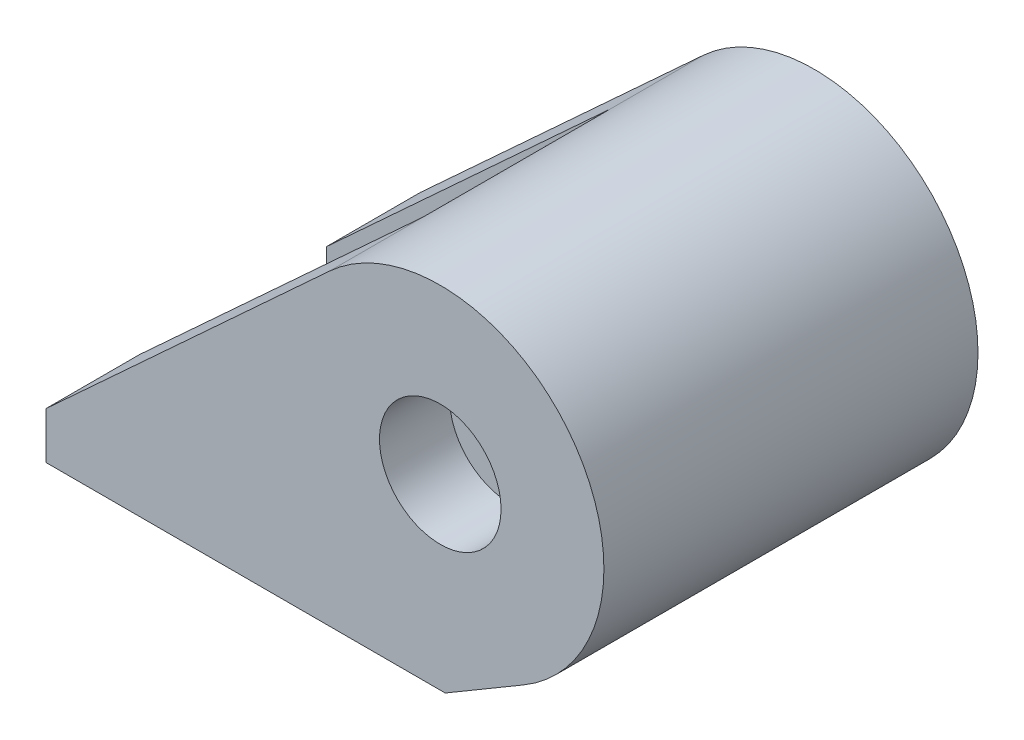
ISO-10303-21;
HEADER;
FILE_DESCRIPTION(('STEP AP214'),'2;1');
FILE_NAME('part.step','',(''),(''),'','','');
FILE_SCHEMA(('AUTOMOTIVE_DESIGN { 1 0 10303 214 1 1 1 1 }'));
ENDSEC;
DATA;
#1=APPLICATION_CONTEXT('core data for automotive mechanical design processes');
#2=APPLICATION_PROTOCOL_DEFINITION('international standard','automotive_design',2000,#1);
#3=PRODUCT_CONTEXT('',#1,'mechanical');
#4=PRODUCT('Part','Part','',(#3));
#5=PRODUCT_RELATED_PRODUCT_CATEGORY('part','',(#4));
#6=PRODUCT_DEFINITION_FORMATION('','',#4);
#7=PRODUCT_DEFINITION_CONTEXT('part definition',#1,'design');
#8=PRODUCT_DEFINITION('design','',#6,#7);
#9=PRODUCT_DEFINITION_SHAPE('','',#8);
#10=(LENGTH_UNIT() NAMED_UNIT(*) SI_UNIT(.MILLI.,.METRE.));
#11=(NAMED_UNIT(*) PLANE_ANGLE_UNIT() SI_UNIT($,.RADIAN.));
#12=(NAMED_UNIT(*) SI_UNIT($,.STERADIAN.) SOLID_ANGLE_UNIT());
#13=UNCERTAINTY_MEASURE_WITH_UNIT(LENGTH_MEASURE(1.E-05),#10,'distance_accuracy_value','');
#14=(GEOMETRIC_REPRESENTATION_CONTEXT(3) GLOBAL_UNCERTAINTY_ASSIGNED_CONTEXT((#13)) GLOBAL_UNIT_ASSIGNED_CONTEXT((#10,
#11,#12)) REPRESENTATION_CONTEXT('',''));
#15=CARTESIAN_POINT('',(0.,0.,0.));
#16=DIRECTION('',(0.,0.,1.));
#17=DIRECTION('',(1.,0.,0.));
#18=AXIS2_PLACEMENT_3D('',#15,#16,#17);
#19=CARTESIAN_POINT('',(-84.3144225047255,-40.,20.));
#20=DIRECTION('',(0.,0.,-1.));
#21=DIRECTION('',(-1.,0.,0.));
#22=AXIS2_PLACEMENT_3D('',#19,#20,#21);
#23=PLANE('',#22);
#24=CARTESIAN_POINT('',(0.,0.,20.));
#25=DIRECTION('',(0.,0.,-1.));
#26=DIRECTION('',(-1.,0.,0.));
#27=AXIS2_PLACEMENT_3D('',#24,#25,#26);
#28=CIRCLE('',#27,35.);
#29=CARTESIAN_POINT('',(-23.6945704185339,25.7598007112078,20.));
#30=VERTEX_POINT('',#29);
#31=CARTESIAN_POINT('',(-35.,0.,20.));
#32=VERTEX_POINT('',#31);
#33=EDGE_CURVE('E180',#30,#32,#28,.F.);
#34=ORIENTED_EDGE('',*,*,#33,.F.);
#35=DIRECTION('',(0.735994306034508,0.676987726243824,0.));
#36=VECTOR('',#35,1.);
#37=CARTESIAN_POINT('',(-84.3144225047255,-30.,20.));
#38=LINE('',#37,#36);
#39=CARTESIAN_POINT('',(-84.3144225047255,-30.,20.));
#40=VERTEX_POINT('',#39);
#41=EDGE_CURVE('E192',#40,#30,#38,.T.);
#42=ORIENTED_EDGE('',*,*,#41,.F.);
#43=DIRECTION('',(0.,1.,0.));
#44=VECTOR('',#43,1.);
#45=CARTESIAN_POINT('',(-84.3144225047255,-40.,20.));
#46=LINE('',#45,#44);
#47=CARTESIAN_POINT('',(-84.3144225047255,-40.,20.));
#48=VERTEX_POINT('',#47);
#49=EDGE_CURVE('E306',#48,#40,#46,.T.);
#50=ORIENTED_EDGE('',*,*,#49,.F.);
#51=DIRECTION('',(-1.,0.,0.));
#52=VECTOR('',#51,1.);
#53=CARTESIAN_POINT('',(-84.3144225047255,-40.,20.));
#54=LINE('',#53,#52);
#55=CARTESIAN_POINT('',(-64.3144225047255,-40.,20.));
#56=VERTEX_POINT('',#55);
#57=EDGE_CURVE('E301',#56,#48,#54,.T.);
#58=ORIENTED_EDGE('',*,*,#57,.F.);
#59=DIRECTION('',(0.,1.,0.));
#60=VECTOR('',#59,1.);
#61=CARTESIAN_POINT('',(-64.3144225047255,-40.,20.));
#62=LINE('',#61,#60);
#63=CARTESIAN_POINT('',(-64.3144225047255,-24.,20.));
#64=VERTEX_POINT('',#63);
#65=EDGE_CURVE('E309',#56,#64,#62,.T.);
#66=ORIENTED_EDGE('',*,*,#65,.T.);
#67=DIRECTION('',(-1.,0.,0.));
#68=VECTOR('',#67,1.);
#69=CARTESIAN_POINT('',(-64.3144225047255,-24.,20.));
#70=LINE('',#69,#68);
#71=CARTESIAN_POINT('',(-35.,-24.,20.));
#72=VERTEX_POINT('',#71);
#73=EDGE_CURVE('E262',#72,#64,#70,.T.);
#74=ORIENTED_EDGE('',*,*,#73,.F.);
#75=DIRECTION('',(0.,-1.,0.));
#76=VECTOR('',#75,1.);
#77=CARTESIAN_POINT('',(-35.,-40.,20.));
#78=LINE('',#77,#76);
#79=EDGE_CURVE('E55',#32,#72,#78,.T.);
#80=ORIENTED_EDGE('',*,*,#79,.F.);
#81=EDGE_LOOP('',(#34,#42,#50,#58,#66,#74,#80));
#82=FACE_BOUND('',#81,.T.);
#83=ADVANCED_FACE('F39',(#82),#23,.F.);
#84=CARTESIAN_POINT('',(-84.3144225047255,-40.,60.));
#85=DIRECTION('',(0.,0.,1.));
#86=DIRECTION('',(1.,0.,0.));
#87=AXIS2_PLACEMENT_3D('',#84,#85,#86);
#88=PLANE('',#87);
#89=CARTESIAN_POINT('',(0.,0.,60.));
#90=DIRECTION('',(0.,0.,1.));
#91=DIRECTION('',(1.,0.,0.));
#92=AXIS2_PLACEMENT_3D('',#89,#90,#91);
#93=CIRCLE('',#92,35.);
#94=CARTESIAN_POINT('',(-23.6945704185339,25.7598007112078,60.));
#95=VERTEX_POINT('',#94);
#96=CARTESIAN_POINT('',(-35.,0.,60.));
#97=VERTEX_POINT('',#96);
#98=EDGE_CURVE('E63',#95,#97,#93,.T.);
#99=ORIENTED_EDGE('',*,*,#98,.T.);
#100=DIRECTION('',(0.,-1.,0.));
#101=VECTOR('',#100,1.);
#102=CARTESIAN_POINT('',(-35.,0.,60.));
#103=LINE('',#102,#101);
#104=CARTESIAN_POINT('',(-35.,-24.,60.));
#105=VERTEX_POINT('',#104);
#106=EDGE_CURVE('E393',#97,#105,#103,.T.);
#107=ORIENTED_EDGE('',*,*,#106,.T.);
#108=DIRECTION('',(1.,0.,0.));
#109=VECTOR('',#108,1.);
#110=CARTESIAN_POINT('',(-64.3144225047255,-24.,60.));
#111=LINE('',#110,#109);
#112=CARTESIAN_POINT('',(-64.3144225047255,-24.,60.));
#113=VERTEX_POINT('',#112);
#114=EDGE_CURVE('E258',#113,#105,#111,.T.);
#115=ORIENTED_EDGE('',*,*,#114,.F.);
#116=DIRECTION('',(0.,1.,0.));
#117=VECTOR('',#116,1.);
#118=CARTESIAN_POINT('',(-64.3144225047255,-40.,60.));
#119=LINE('',#118,#117);
#120=CARTESIAN_POINT('',(-64.3144225047255,-40.,60.));
#121=VERTEX_POINT('',#120);
#122=EDGE_CURVE('E313',#121,#113,#119,.T.);
#123=ORIENTED_EDGE('',*,*,#122,.F.);
#124=DIRECTION('',(1.,0.,0.));
#125=VECTOR('',#124,1.);
#126=CARTESIAN_POINT('',(-84.3144225047255,-40.,60.));
#127=LINE('',#126,#125);
#128=CARTESIAN_POINT('',(-84.3144225047255,-40.,60.));
#129=VERTEX_POINT('',#128);
#130=EDGE_CURVE('E292',#129,#121,#127,.T.);
#131=ORIENTED_EDGE('',*,*,#130,.F.);
#132=DIRECTION('',(0.,1.,0.));
#133=VECTOR('',#132,1.);
#134=CARTESIAN_POINT('',(-84.3144225047255,-40.,60.));
#135=LINE('',#134,#133);
#136=CARTESIAN_POINT('',(-84.3144225047255,-30.,60.));
#137=VERTEX_POINT('',#136);
#138=EDGE_CURVE('E305',#129,#137,#135,.T.);
#139=ORIENTED_EDGE('',*,*,#138,.T.);
#140=DIRECTION('',(-0.735994306034508,-0.676987726243824,0.));
#141=VECTOR('',#140,1.);
#142=CARTESIAN_POINT('',(-84.3144225047255,-30.,60.));
#143=LINE('',#142,#141);
#144=EDGE_CURVE('E198',#95,#137,#143,.T.);
#145=ORIENTED_EDGE('',*,*,#144,.F.);
#146=EDGE_LOOP('',(#99,#107,#115,#123,#131,#139,#145));
#147=FACE_BOUND('',#146,.T.);
#148=ADVANCED_FACE('F392',(#147),#88,.F.);
#149=CARTESIAN_POINT('',(-55.,-24.,40.));
#150=DIRECTION('',(0.,1.,0.));
#151=DIRECTION('',(0.,0.,1.));
#152=AXIS2_PLACEMENT_3D('',#149,#150,#151);
#153=PLANE('',#152);
#154=ORIENTED_EDGE('',*,*,#114,.T.);
#155=DIRECTION('',(0.,0.,-1.));
#156=VECTOR('',#155,1.);
#157=CARTESIAN_POINT('',(-35.,-24.,60.));
#158=LINE('',#157,#156);
#159=EDGE_CURVE('E207',#105,#72,#158,.T.);
#160=ORIENTED_EDGE('',*,*,#159,.T.);
#161=ORIENTED_EDGE('',*,*,#73,.T.);
#162=DIRECTION('',(0.,0.,1.));
#163=VECTOR('',#162,1.);
#164=CARTESIAN_POINT('',(-64.3144225047255,-24.,20.));
#165=LINE('',#164,#163);
#166=CARTESIAN_POINT('',(-64.3144225047255,-24.,25.));
#167=VERTEX_POINT('',#166);
#168=EDGE_CURVE('E48',#64,#167,#165,.T.);
#169=ORIENTED_EDGE('',*,*,#168,.T.);
#170=DIRECTION('',(-1.,0.,0.));
#171=VECTOR('',#170,1.);
#172=CARTESIAN_POINT('',(-55.,-24.,25.));
#173=LINE('',#172,#171);
#174=CARTESIAN_POINT('',(-55.,-24.,25.));
#175=VERTEX_POINT('',#174);
#176=EDGE_CURVE('E227',#175,#167,#173,.T.);
#177=ORIENTED_EDGE('',*,*,#176,.F.);
#178=CARTESIAN_POINT('',(-55.,-24.,40.));
#179=DIRECTION('',(0.,1.,0.));
#180=DIRECTION('',(0.,0.,1.));
#181=AXIS2_PLACEMENT_3D('',#178,#179,#180);
#182=CIRCLE('',#181,15.);
#183=CARTESIAN_POINT('',(-55.,-24.,55.));
#184=VERTEX_POINT('',#183);
#185=EDGE_CURVE('E205',#184,#175,#182,.T.);
#186=ORIENTED_EDGE('',*,*,#185,.F.);
#187=DIRECTION('',(1.,0.,0.));
#188=VECTOR('',#187,1.);
#189=CARTESIAN_POINT('',(-55.,-24.,55.));
#190=LINE('',#189,#188);
#191=CARTESIAN_POINT('',(-64.3144225047255,-24.,55.));
#192=VERTEX_POINT('',#191);
#193=EDGE_CURVE('E216',#192,#184,#190,.T.);
#194=ORIENTED_EDGE('',*,*,#193,.F.);
#195=EDGE_CURVE('E377',#192,#113,#165,.T.);
#196=ORIENTED_EDGE('',*,*,#195,.T.);
#197=EDGE_LOOP('',(#154,#160,#161,#169,#177,#186,#194,#196));
#198=FACE_BOUND('',#197,.T.);
#199=ADVANCED_FACE('F387',(#198),#153,.T.);
#200=CARTESIAN_POINT('',(-84.3144225047255,-30.,80.));
#201=DIRECTION('',(0.676987726243824,-0.735994306034508,0.));
#202=DIRECTION('',(0.735994306034508,0.676987726243824,0.));
#203=AXIS2_PLACEMENT_3D('',#200,#201,#202);
#204=PLANE('',#203);
#205=DIRECTION('',(0.,0.,-1.));
#206=VECTOR('',#205,1.);
#207=CARTESIAN_POINT('',(-23.6945704185339,25.7598007112078,80.));
#208=LINE('',#207,#206);
#209=CARTESIAN_POINT('',(-23.6945704185339,25.7598007112078,80.));
#210=VERTEX_POINT('',#209);
#211=EDGE_CURVE('E188',#210,#95,#208,.T.);
#212=ORIENTED_EDGE('',*,*,#211,.T.);
#213=ORIENTED_EDGE('',*,*,#144,.T.);
#214=DIRECTION('',(0.,0.,-1.));
#215=VECTOR('',#214,1.);
#216=CARTESIAN_POINT('',(-84.3144225047255,-30.,80.));
#217=LINE('',#216,#215);
#218=CARTESIAN_POINT('',(-84.3144225047255,-30.,80.));
#219=VERTEX_POINT('',#218);
#220=EDGE_CURVE('E189',#219,#137,#217,.T.);
#221=ORIENTED_EDGE('',*,*,#220,.F.);
#222=DIRECTION('',(-0.735994306034508,-0.676987726243824,0.));
#223=VECTOR('',#222,1.);
#224=CARTESIAN_POINT('',(-84.3144225047255,-30.,80.));
#225=LINE('',#224,#223);
#226=EDGE_CURVE('E333',#210,#219,#225,.T.);
#227=ORIENTED_EDGE('',*,*,#226,.F.);
#228=EDGE_LOOP('',(#212,#213,#221,#227));
#229=FACE_BOUND('',#228,.T.);
#230=ADVANCED_FACE('F408',(#229),#204,.F.);
#231=ORIENTED_EDGE('',*,*,#41,.T.);
#232=CARTESIAN_POINT('',(-23.6945704185339,25.7598007112078,0.));
#233=VERTEX_POINT('',#232);
#234=EDGE_CURVE('E177',#30,#233,#208,.T.);
#235=ORIENTED_EDGE('',*,*,#234,.T.);
#236=DIRECTION('',(-0.735994306034508,-0.676987726243824,0.));
#237=VECTOR('',#236,1.);
#238=CARTESIAN_POINT('',(-84.3144225047255,-30.,0.));
#239=LINE('',#238,#237);
#240=CARTESIAN_POINT('',(-84.3144225047255,-30.,0.));
#241=VERTEX_POINT('',#240);
#242=EDGE_CURVE('E349',#233,#241,#239,.T.);
#243=ORIENTED_EDGE('',*,*,#242,.T.);
#244=EDGE_CURVE('E194',#40,#241,#217,.T.);
#245=ORIENTED_EDGE('',*,*,#244,.F.);
#246=EDGE_LOOP('',(#231,#235,#243,#245));
#247=FACE_BOUND('',#246,.T.);
#248=ADVANCED_FACE('F193',(#247),#204,.F.);
#249=CARTESIAN_POINT('',(-55.,-40.,48.));
#250=DIRECTION('',(0.,0.,1.));
#251=DIRECTION('',(1.,0.,0.));
#252=AXIS2_PLACEMENT_3D('',#249,#250,#251);
#253=PLANE('',#252);
#254=DIRECTION('',(-1.,0.,0.));
#255=VECTOR('',#254,1.);
#256=CARTESIAN_POINT('',(-55.,-30.,48.));
#257=LINE('',#256,#255);
#258=CARTESIAN_POINT('',(-55.,-30.,48.));
#259=VERTEX_POINT('',#258);
#260=CARTESIAN_POINT('',(-64.3144225047255,-30.,48.));
#261=VERTEX_POINT('',#260);
#262=EDGE_CURVE('E241',#259,#261,#257,.T.);
#263=ORIENTED_EDGE('',*,*,#262,.F.);
#264=DIRECTION('',(0.,1.,0.));
#265=VECTOR('',#264,1.);
#266=CARTESIAN_POINT('',(-55.,-40.,48.));
#267=LINE('',#266,#265);
#268=CARTESIAN_POINT('',(-55.,-40.,48.));
#269=VERTEX_POINT('',#268);
#270=EDGE_CURVE('E278',#269,#259,#267,.T.);
#271=ORIENTED_EDGE('',*,*,#270,.F.);
#272=DIRECTION('',(1.,0.,0.));
#273=VECTOR('',#272,1.);
#274=CARTESIAN_POINT('',(-55.,-40.,48.));
#275=LINE('',#274,#273);
#276=CARTESIAN_POINT('',(-64.3144225047255,-40.,48.));
#277=VERTEX_POINT('',#276);
#278=EDGE_CURVE('E273',#277,#269,#275,.T.);
#279=ORIENTED_EDGE('',*,*,#278,.F.);
#280=DIRECTION('',(0.,-1.,0.));
#281=VECTOR('',#280,1.);
#282=CARTESIAN_POINT('',(-64.3144225047255,-40.,48.));
#283=LINE('',#282,#281);
#284=EDGE_CURVE('E289',#261,#277,#283,.T.);
#285=ORIENTED_EDGE('',*,*,#284,.F.);
#286=EDGE_LOOP('',(#263,#271,#279,#285));
#287=FACE_BOUND('',#286,.T.);
#288=ADVANCED_FACE('F475',(#287),#253,.F.);
#289=CARTESIAN_POINT('',(-92.7334325278807,-40.,32.));
#290=DIRECTION('',(0.,0.,-1.));
#291=DIRECTION('',(-1.,0.,0.));
#292=AXIS2_PLACEMENT_3D('',#289,#290,#291);
#293=PLANE('',#292);
#294=DIRECTION('',(1.,0.,0.));
#295=VECTOR('',#294,1.);
#296=CARTESIAN_POINT('',(-92.7334325278807,-30.,32.));
#297=LINE('',#296,#295);
#298=CARTESIAN_POINT('',(-64.3144225047255,-30.,32.));
#299=VERTEX_POINT('',#298);
#300=CARTESIAN_POINT('',(-55.,-30.,32.));
#301=VERTEX_POINT('',#300);
#302=EDGE_CURVE('E236',#299,#301,#297,.T.);
#303=ORIENTED_EDGE('',*,*,#302,.F.);
#304=DIRECTION('',(0.,1.,0.));
#305=VECTOR('',#304,1.);
#306=CARTESIAN_POINT('',(-64.3144225047255,-40.,32.));
#307=LINE('',#306,#305);
#308=CARTESIAN_POINT('',(-64.3144225047255,-40.,32.));
#309=VERTEX_POINT('',#308);
#310=EDGE_CURVE('E282',#309,#299,#307,.T.);
#311=ORIENTED_EDGE('',*,*,#310,.F.);
#312=DIRECTION('',(-1.,0.,0.));
#313=VECTOR('',#312,1.);
#314=CARTESIAN_POINT('',(-92.7334325278807,-40.,32.));
#315=LINE('',#314,#313);
#316=CARTESIAN_POINT('',(-55.,-40.,32.));
#317=VERTEX_POINT('',#316);
#318=EDGE_CURVE('E269',#317,#309,#315,.T.);
#319=ORIENTED_EDGE('',*,*,#318,.F.);
#320=DIRECTION('',(0.,1.,0.));
#321=VECTOR('',#320,1.);
#322=CARTESIAN_POINT('',(-55.,-40.,32.));
#323=LINE('',#322,#321);
#324=EDGE_CURVE('E277',#317,#301,#323,.T.);
#325=ORIENTED_EDGE('',*,*,#324,.T.);
#326=EDGE_LOOP('',(#303,#311,#319,#325));
#327=FACE_BOUND('',#326,.T.);
#328=ADVANCED_FACE('F602',(#327),#293,.F.);
#329=CARTESIAN_POINT('',(-55.,-40.,40.));
#330=DIRECTION('',(0.,1.,0.));
#331=DIRECTION('',(0.,0.,1.));
#332=AXIS2_PLACEMENT_3D('',#329,#330,#331);
#333=CYLINDRICAL_SURFACE('',#332,8.);
#334=CARTESIAN_POINT('',(-55.,-30.,40.));
#335=DIRECTION('',(0.,1.,0.));
#336=DIRECTION('',(0.,0.,1.));
#337=AXIS2_PLACEMENT_3D('',#334,#335,#336);
#338=CIRCLE('',#337,8.);
#339=EDGE_CURVE('E11',#301,#259,#338,.F.);
#340=ORIENTED_EDGE('',*,*,#339,.F.);
#341=ORIENTED_EDGE('',*,*,#324,.F.);
#342=CARTESIAN_POINT('',(-55.,-40.,40.));
#343=DIRECTION('',(0.,1.,0.));
#344=DIRECTION('',(0.,0.,1.));
#345=AXIS2_PLACEMENT_3D('',#342,#343,#344);
#346=CIRCLE('',#345,8.);
#347=EDGE_CURVE('E265',#269,#317,#346,.T.);
#348=ORIENTED_EDGE('',*,*,#347,.F.);
#349=ORIENTED_EDGE('',*,*,#270,.T.);
#350=EDGE_LOOP('',(#340,#341,#348,#349));
#351=FACE_BOUND('',#350,.T.);
#352=ADVANCED_FACE('F443',(#351),#333,.F.);
#353=CARTESIAN_POINT('',(-64.3144225047255,-40.,20.));
#354=DIRECTION('',(1.,0.,0.));
#355=DIRECTION('',(0.,0.,-1.));
#356=AXIS2_PLACEMENT_3D('',#353,#354,#355);
#357=PLANE('',#356);
#358=ORIENTED_EDGE('',*,*,#195,.F.);
#359=DIRECTION('',(0.,-1.,0.));
#360=VECTOR('',#359,1.);
#361=CARTESIAN_POINT('',(-64.3144225047255,-40.,55.));
#362=LINE('',#361,#360);
#363=CARTESIAN_POINT('',(-64.3144225047255,-30.,55.));
#364=VERTEX_POINT('',#363);
#365=EDGE_CURVE('E254',#192,#364,#362,.T.);
#366=ORIENTED_EDGE('',*,*,#365,.T.);
#367=DIRECTION('',(0.,0.,1.));
#368=VECTOR('',#367,1.);
#369=CARTESIAN_POINT('',(-64.3144225047255,-30.,20.));
#370=LINE('',#369,#368);
#371=EDGE_CURVE('E247',#261,#364,#370,.T.);
#372=ORIENTED_EDGE('',*,*,#371,.F.);
#373=ORIENTED_EDGE('',*,*,#284,.T.);
#374=DIRECTION('',(0.,0.,-1.));
#375=VECTOR('',#374,1.);
#376=CARTESIAN_POINT('',(-64.3144225047255,-40.,20.));
#377=LINE('',#376,#375);
#378=EDGE_CURVE('E297',#121,#277,#377,.T.);
#379=ORIENTED_EDGE('',*,*,#378,.F.);
#380=ORIENTED_EDGE('',*,*,#122,.T.);
#381=EDGE_LOOP('',(#358,#366,#372,#373,#379,#380));
#382=FACE_BOUND('',#381,.T.);
#383=ADVANCED_FACE('F394',(#382),#357,.F.);
#384=DIRECTION('',(0.,0.,1.));
#385=VECTOR('',#384,1.);
#386=CARTESIAN_POINT('',(-64.3144225047255,-30.,20.));
#387=LINE('',#386,#385);
#388=CARTESIAN_POINT('',(-64.3144225047255,-30.,25.));
#389=VERTEX_POINT('',#388);
#390=EDGE_CURVE('E244',#389,#299,#387,.T.);
#391=ORIENTED_EDGE('',*,*,#390,.F.);
#392=DIRECTION('',(0.,1.,0.));
#393=VECTOR('',#392,1.);
#394=CARTESIAN_POINT('',(-64.3144225047255,-40.,25.));
#395=LINE('',#394,#393);
#396=EDGE_CURVE('E250',#389,#167,#395,.T.);
#397=ORIENTED_EDGE('',*,*,#396,.T.);
#398=ORIENTED_EDGE('',*,*,#168,.F.);
#399=ORIENTED_EDGE('',*,*,#65,.F.);
#400=EDGE_CURVE('E296',#309,#56,#377,.T.);
#401=ORIENTED_EDGE('',*,*,#400,.F.);
#402=ORIENTED_EDGE('',*,*,#310,.T.);
#403=EDGE_LOOP('',(#391,#397,#398,#399,#401,#402));
#404=FACE_BOUND('',#403,.T.);
#405=ADVANCED_FACE('F442',(#404),#357,.F.);
#406=CARTESIAN_POINT('',(-84.3144225047255,-30.,80.));
#407=DIRECTION('',(1.,0.,0.));
#408=DIRECTION('',(0.,0.,-1.));
#409=AXIS2_PLACEMENT_3D('',#406,#407,#408);
#410=PLANE('',#409);
#411=DIRECTION('',(0.,0.,-1.));
#412=VECTOR('',#411,1.);
#413=CARTESIAN_POINT('',(-84.3144225047255,-40.,80.));
#414=LINE('',#413,#412);
#415=CARTESIAN_POINT('',(-84.3144225047255,-40.,0.));
#416=VERTEX_POINT('',#415);
#417=EDGE_CURVE('E368',#48,#416,#414,.T.);
#418=ORIENTED_EDGE('',*,*,#417,.F.);
#419=ORIENTED_EDGE('',*,*,#49,.T.);
#420=ORIENTED_EDGE('',*,*,#244,.T.);
#421=DIRECTION('',(0.,-1.,0.));
#422=VECTOR('',#421,1.);
#423=CARTESIAN_POINT('',(-84.3144225047255,-30.,0.));
#424=LINE('',#423,#422);
#425=EDGE_CURVE('E352',#241,#416,#424,.T.);
#426=ORIENTED_EDGE('',*,*,#425,.T.);
#427=EDGE_LOOP('',(#418,#419,#420,#426));
#428=FACE_BOUND('',#427,.T.);
#429=ADVANCED_FACE('F468',(#428),#410,.F.);
#430=CARTESIAN_POINT('',(0.,0.,80.));
#431=DIRECTION('',(0.,0.,-1.));
#432=DIRECTION('',(-1.,0.,0.));
#433=AXIS2_PLACEMENT_3D('',#430,#431,#432);
#434=CYLINDRICAL_SURFACE('',#433,35.);
#435=DIRECTION('',(0.,0.,-1.));
#436=VECTOR('',#435,1.);
#437=CARTESIAN_POINT('',(17.7692307692308,-30.1538461538461,80.));
#438=LINE('',#437,#436);
#439=CARTESIAN_POINT('',(17.7692307692308,-30.1538461538461,80.));
#440=VERTEX_POINT('',#439);
#441=CARTESIAN_POINT('',(17.7692307692308,-30.1538461538461,0.));
#442=VERTEX_POINT('',#441);
#443=EDGE_CURVE('E346',#440,#442,#438,.T.);
#444=ORIENTED_EDGE('',*,*,#443,.T.);
#445=CARTESIAN_POINT('',(0.,0.,0.));
#446=DIRECTION('',(0.,0.,1.));
#447=DIRECTION('',(1.,0.,0.));
#448=AXIS2_PLACEMENT_3D('',#445,#446,#447);
#449=CIRCLE('',#448,35.);
#450=EDGE_CURVE('E183',#442,#233,#449,.T.);
#451=ORIENTED_EDGE('',*,*,#450,.T.);
#452=ORIENTED_EDGE('',*,*,#234,.F.);
#453=ORIENTED_EDGE('',*,*,#33,.T.);
#454=DIRECTION('',(0.,0.,-1.));
#455=VECTOR('',#454,1.);
#456=CARTESIAN_POINT('',(-35.,0.,60.));
#457=LINE('',#456,#455);
#458=EDGE_CURVE('E201',#97,#32,#457,.T.);
#459=ORIENTED_EDGE('',*,*,#458,.F.);
#460=ORIENTED_EDGE('',*,*,#98,.F.);
#461=ORIENTED_EDGE('',*,*,#211,.F.);
#462=CARTESIAN_POINT('',(0.,0.,80.));
#463=DIRECTION('',(0.,0.,1.));
#464=DIRECTION('',(1.,0.,0.));
#465=AXIS2_PLACEMENT_3D('',#462,#463,#464);
#466=CIRCLE('',#465,35.);
#467=EDGE_CURVE('E329',#440,#210,#466,.T.);
#468=ORIENTED_EDGE('',*,*,#467,.F.);
#469=EDGE_LOOP('',(#444,#451,#452,#453,#459,#460,#461,#468));
#470=FACE_BOUND('',#469,.T.);
#471=ADVANCED_FACE('F41',(#470),#434,.T.);
#472=ORIENTED_EDGE('',*,*,#220,.T.);
#473=ORIENTED_EDGE('',*,*,#138,.F.);
#474=CARTESIAN_POINT('',(-84.3144225047255,-40.,80.));
#475=VERTEX_POINT('',#474);
#476=EDGE_CURVE('E369',#475,#129,#414,.T.);
#477=ORIENTED_EDGE('',*,*,#476,.F.);
#478=DIRECTION('',(0.,-1.,0.));
#479=VECTOR('',#478,1.);
#480=CARTESIAN_POINT('',(-84.3144225047255,-30.,80.));
#481=LINE('',#480,#479);
#482=EDGE_CURVE('E337',#219,#475,#481,.T.);
#483=ORIENTED_EDGE('',*,*,#482,.F.);
#484=EDGE_LOOP('',(#472,#473,#477,#483));
#485=FACE_BOUND('',#484,.T.);
#486=ADVANCED_FACE('F404',(#485),#410,.F.);
#487=CARTESIAN_POINT('',(-84.3144225047255,-40.,80.));
#488=DIRECTION('',(0.,1.,0.));
#489=DIRECTION('',(-1.,0.,0.));
#490=AXIS2_PLACEMENT_3D('',#487,#488,#489);
#491=PLANE('',#490);
#492=ORIENTED_EDGE('',*,*,#378,.T.);
#493=ORIENTED_EDGE('',*,*,#278,.T.);
#494=ORIENTED_EDGE('',*,*,#347,.T.);
#495=ORIENTED_EDGE('',*,*,#318,.T.);
#496=ORIENTED_EDGE('',*,*,#400,.T.);
#497=ORIENTED_EDGE('',*,*,#57,.T.);
#498=ORIENTED_EDGE('',*,*,#417,.T.);
#499=DIRECTION('',(1.,0.,0.));
#500=VECTOR('',#499,1.);
#501=CARTESIAN_POINT('',(-84.3144225047255,-40.,0.));
#502=LINE('',#501,#500);
#503=CARTESIAN_POINT('',(1.0606060606061,-40.,0.));
#504=VERTEX_POINT('',#503);
#505=EDGE_CURVE('E356',#416,#504,#502,.T.);
#506=ORIENTED_EDGE('',*,*,#505,.T.);
#507=DIRECTION('',(0.,0.,-1.));
#508=VECTOR('',#507,1.);
#509=CARTESIAN_POINT('',(1.0606060606061,-40.,80.));
#510=LINE('',#509,#508);
#511=CARTESIAN_POINT('',(1.0606060606061,-40.,80.));
#512=VERTEX_POINT('',#511);
#513=EDGE_CURVE('E364',#512,#504,#510,.T.);
#514=ORIENTED_EDGE('',*,*,#513,.F.);
#515=DIRECTION('',(1.,0.,0.));
#516=VECTOR('',#515,1.);
#517=CARTESIAN_POINT('',(-84.3144225047255,-40.,80.));
#518=LINE('',#517,#516);
#519=EDGE_CURVE('E340',#475,#512,#518,.T.);
#520=ORIENTED_EDGE('',*,*,#519,.F.);
#521=ORIENTED_EDGE('',*,*,#476,.T.);
#522=ORIENTED_EDGE('',*,*,#130,.T.);
#523=EDGE_LOOP('',(#492,#493,#494,#495,#496,#497,#498,#506,#514,#520,#521,#522));
#524=FACE_BOUND('',#523,.T.);
#525=ADVANCED_FACE('F399',(#524),#491,.F.);
#526=CARTESIAN_POINT('',(1.0606060606061,-40.,80.));
#527=DIRECTION('',(-0.507692307692308,0.861538461538461,0.));
#528=DIRECTION('',(-0.861538461538461,-0.507692307692308,0.));
#529=AXIS2_PLACEMENT_3D('',#526,#527,#528);
#530=PLANE('',#529);
#531=DIRECTION('',(0.861538461538461,0.507692307692308,0.));
#532=VECTOR('',#531,1.);
#533=CARTESIAN_POINT('',(1.0606060606061,-40.,0.));
#534=LINE('',#533,#532);
#535=EDGE_CURVE('E334',#504,#442,#534,.T.);
#536=ORIENTED_EDGE('',*,*,#535,.T.);
#537=ORIENTED_EDGE('',*,*,#443,.F.);
#538=DIRECTION('',(0.861538461538461,0.507692307692308,0.));
#539=VECTOR('',#538,1.);
#540=CARTESIAN_POINT('',(1.0606060606061,-40.,80.));
#541=LINE('',#540,#539);
#542=EDGE_CURVE('E343',#512,#440,#541,.T.);
#543=ORIENTED_EDGE('',*,*,#542,.F.);
#544=ORIENTED_EDGE('',*,*,#513,.T.);
#545=EDGE_LOOP('',(#536,#537,#543,#544));
#546=FACE_BOUND('',#545,.T.);
#547=ADVANCED_FACE('F458',(#546),#530,.F.);
#548=CARTESIAN_POINT('',(0.,0.,80.));
#549=DIRECTION('',(0.,0.,1.));
#550=DIRECTION('',(1.,0.,0.));
#551=AXIS2_PLACEMENT_3D('',#548,#549,#550);
#552=PLANE('',#551);
#553=CARTESIAN_POINT('',(0.,0.,80.));
#554=DIRECTION('',(0.,0.,1.));
#555=DIRECTION('',(1.,0.,0.));
#556=AXIS2_PLACEMENT_3D('',#553,#554,#555);
#557=CIRCLE('',#556,13.);
#558=CARTESIAN_POINT('',(13.,0.,80.));
#559=VERTEX_POINT('',#558);
#560=EDGE_CURVE('E197',#559,#559,#557,.T.);
#561=ORIENTED_EDGE('',*,*,#560,.F.);
#562=EDGE_LOOP('',(#561));
#563=FACE_BOUND('',#562,.T.);
#564=ORIENTED_EDGE('',*,*,#467,.T.);
#565=ORIENTED_EDGE('',*,*,#226,.T.);
#566=ORIENTED_EDGE('',*,*,#482,.T.);
#567=ORIENTED_EDGE('',*,*,#519,.T.);
#568=ORIENTED_EDGE('',*,*,#542,.T.);
#569=EDGE_LOOP('',(#564,#565,#566,#567,#568));
#570=FACE_BOUND('',#569,.T.);
#571=ADVANCED_FACE('F455',(#563,#570),#552,.T.);
#572=CARTESIAN_POINT('',(0.,0.,0.));
#573=DIRECTION('',(0.,0.,1.));
#574=DIRECTION('',(1.,0.,0.));
#575=AXIS2_PLACEMENT_3D('',#572,#573,#574);
#576=PLANE('',#575);
#577=ORIENTED_EDGE('',*,*,#242,.F.);
#578=ORIENTED_EDGE('',*,*,#450,.F.);
#579=ORIENTED_EDGE('',*,*,#535,.F.);
#580=ORIENTED_EDGE('',*,*,#505,.F.);
#581=ORIENTED_EDGE('',*,*,#425,.F.);
#582=EDGE_LOOP('',(#577,#578,#579,#580,#581));
#583=FACE_BOUND('',#582,.T.);
#584=ADVANCED_FACE('F453',(#583),#576,.F.);
#585=CARTESIAN_POINT('',(0.,0.,65.));
#586=DIRECTION('',(0.,0.,1.));
#587=DIRECTION('',(1.,0.,0.));
#588=AXIS2_PLACEMENT_3D('',#585,#586,#587);
#589=CYLINDRICAL_SURFACE('',#588,13.);
#590=CARTESIAN_POINT('',(0.,0.,65.));
#591=DIRECTION('',(0.,0.,1.));
#592=DIRECTION('',(1.,0.,0.));
#593=AXIS2_PLACEMENT_3D('',#590,#591,#592);
#594=CIRCLE('',#593,13.);
#595=CARTESIAN_POINT('',(13.,0.,65.));
#596=VERTEX_POINT('',#595);
#597=EDGE_CURVE('E322',#596,#596,#594,.T.);
#598=ORIENTED_EDGE('',*,*,#597,.F.);
#599=EDGE_LOOP('',(#598));
#600=FACE_BOUND('',#599,.T.);
#601=ORIENTED_EDGE('',*,*,#560,.T.);
#602=EDGE_LOOP('',(#601));
#603=FACE_BOUND('',#602,.T.);
#604=ADVANCED_FACE('F449',(#600,#603),#589,.F.);
#605=CARTESIAN_POINT('',(0.,0.,65.));
#606=DIRECTION('',(0.,0.,1.));
#607=DIRECTION('',(1.,0.,0.));
#608=AXIS2_PLACEMENT_3D('',#605,#606,#607);
#609=PLANE('',#608);
#610=ORIENTED_EDGE('',*,*,#597,.T.);
#611=EDGE_LOOP('',(#610));
#612=FACE_BOUND('',#611,.T.);
#613=ADVANCED_FACE('F445',(#612),#609,.T.);
#614=CARTESIAN_POINT('',(-55.,-30.,55.));
#615=DIRECTION('',(0.,0.,1.));
#616=DIRECTION('',(1.,0.,0.));
#617=AXIS2_PLACEMENT_3D('',#614,#615,#616);
#618=PLANE('',#617);
#619=ORIENTED_EDGE('',*,*,#193,.T.);
#620=DIRECTION('',(0.,1.,0.));
#621=VECTOR('',#620,1.);
#622=CARTESIAN_POINT('',(-55.,-30.,55.));
#623=LINE('',#622,#621);
#624=CARTESIAN_POINT('',(-55.,-30.,55.));
#625=VERTEX_POINT('',#624);
#626=EDGE_CURVE('E232',#625,#184,#623,.T.);
#627=ORIENTED_EDGE('',*,*,#626,.F.);
#628=DIRECTION('',(1.,0.,0.));
#629=VECTOR('',#628,1.);
#630=CARTESIAN_POINT('',(-55.,-30.,55.));
#631=LINE('',#630,#629);
#632=EDGE_CURVE('E220',#364,#625,#631,.T.);
#633=ORIENTED_EDGE('',*,*,#632,.F.);
#634=ORIENTED_EDGE('',*,*,#365,.F.);
#635=EDGE_LOOP('',(#619,#627,#633,#634));
#636=FACE_BOUND('',#635,.T.);
#637=ADVANCED_FACE('F448',(#636),#618,.F.);
#638=CARTESIAN_POINT('',(-55.,-30.,25.));
#639=DIRECTION('',(0.,0.,-1.));
#640=DIRECTION('',(-1.,0.,0.));
#641=AXIS2_PLACEMENT_3D('',#638,#639,#640);
#642=PLANE('',#641);
#643=DIRECTION('',(-1.,0.,0.));
#644=VECTOR('',#643,1.);
#645=CARTESIAN_POINT('',(-55.,-30.,25.));
#646=LINE('',#645,#644);
#647=CARTESIAN_POINT('',(-55.,-30.,25.));
#648=VERTEX_POINT('',#647);
#649=EDGE_CURVE('E215',#648,#389,#646,.T.);
#650=ORIENTED_EDGE('',*,*,#649,.F.);
#651=DIRECTION('',(0.,1.,0.));
#652=VECTOR('',#651,1.);
#653=CARTESIAN_POINT('',(-55.,-30.,25.));
#654=LINE('',#653,#652);
#655=EDGE_CURVE('E223',#648,#175,#654,.T.);
#656=ORIENTED_EDGE('',*,*,#655,.T.);
#657=ORIENTED_EDGE('',*,*,#176,.T.);
#658=ORIENTED_EDGE('',*,*,#396,.F.);
#659=EDGE_LOOP('',(#650,#656,#657,#658));
#660=FACE_BOUND('',#659,.T.);
#661=ADVANCED_FACE('F548',(#660),#642,.F.);
#662=CARTESIAN_POINT('',(-55.,-30.,40.));
#663=DIRECTION('',(0.,1.,0.));
#664=DIRECTION('',(0.,0.,1.));
#665=AXIS2_PLACEMENT_3D('',#662,#663,#664);
#666=PLANE('',#665);
#667=ORIENTED_EDGE('',*,*,#371,.T.);
#668=ORIENTED_EDGE('',*,*,#632,.T.);
#669=CARTESIAN_POINT('',(-55.,-30.,40.));
#670=DIRECTION('',(0.,1.,0.));
#671=DIRECTION('',(0.,0.,1.));
#672=AXIS2_PLACEMENT_3D('',#669,#670,#671);
#673=CIRCLE('',#672,15.);
#674=EDGE_CURVE('E211',#625,#648,#673,.T.);
#675=ORIENTED_EDGE('',*,*,#674,.T.);
#676=ORIENTED_EDGE('',*,*,#649,.T.);
#677=ORIENTED_EDGE('',*,*,#390,.T.);
#678=ORIENTED_EDGE('',*,*,#302,.T.);
#679=ORIENTED_EDGE('',*,*,#339,.T.);
#680=ORIENTED_EDGE('',*,*,#262,.T.);
#681=EDGE_LOOP('',(#667,#668,#675,#676,#677,#678,#679,#680));
#682=FACE_BOUND('',#681,.T.);
#683=ADVANCED_FACE('F427',(#682),#666,.T.);
#684=CARTESIAN_POINT('',(-55.,-30.,40.));
#685=DIRECTION('',(0.,1.,0.));
#686=DIRECTION('',(0.,0.,1.));
#687=AXIS2_PLACEMENT_3D('',#684,#685,#686);
#688=CYLINDRICAL_SURFACE('',#687,15.);
#689=ORIENTED_EDGE('',*,*,#185,.T.);
#690=ORIENTED_EDGE('',*,*,#655,.F.);
#691=ORIENTED_EDGE('',*,*,#674,.F.);
#692=ORIENTED_EDGE('',*,*,#626,.T.);
#693=EDGE_LOOP('',(#689,#690,#691,#692));
#694=FACE_BOUND('',#693,.T.);
#695=ADVANCED_FACE('F421',(#694),#688,.F.);
#696=CARTESIAN_POINT('',(-35.,0.,60.));
#697=DIRECTION('',(1.,0.,0.));
#698=DIRECTION('',(0.,0.,-1.));
#699=AXIS2_PLACEMENT_3D('',#696,#697,#698);
#700=PLANE('',#699);
#701=ORIENTED_EDGE('',*,*,#458,.T.);
#702=ORIENTED_EDGE('',*,*,#79,.T.);
#703=ORIENTED_EDGE('',*,*,#159,.F.);
#704=ORIENTED_EDGE('',*,*,#106,.F.);
#705=EDGE_LOOP('',(#701,#702,#703,#704));
#706=FACE_BOUND('',#705,.T.);
#707=ADVANCED_FACE('F419',(#706),#700,.F.);
#708=CLOSED_SHELL('',(#83,#148,#199,#230,#248,#288,#328,#352,#383,#405,#429,#471,#486,#525,#547,
#571,#584,#604,#613,#637,#661,#683,#695,#707));
#709=MANIFOLD_SOLID_BREP('B2',#708);
#710=ADVANCED_BREP_SHAPE_REPRESENTATION('',(#18,#709),#14);
#711=SHAPE_DEFINITION_REPRESENTATION(#9,#710);
ENDSEC;
END-ISO-10303-21;
